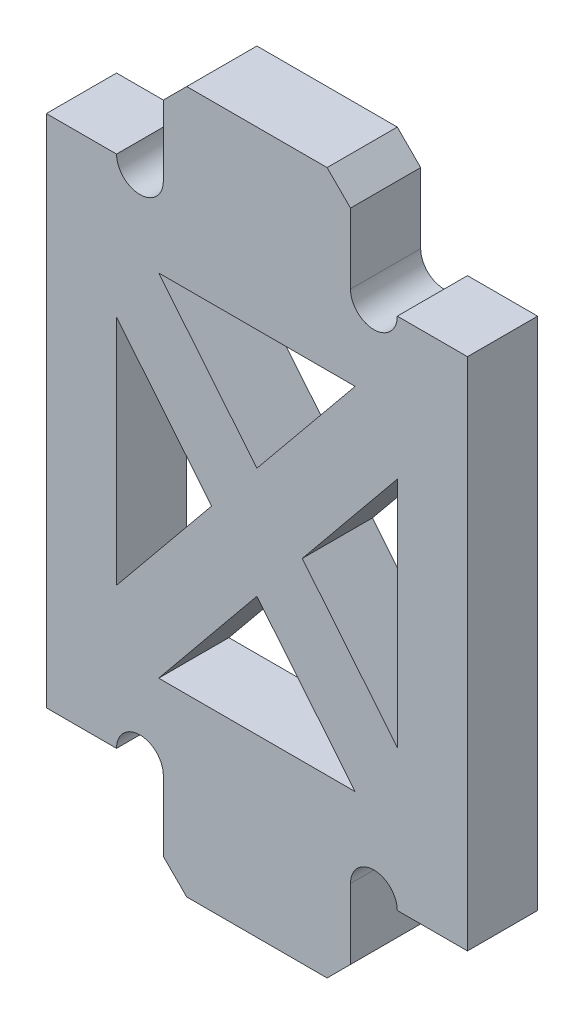
ISO-10303-21;
HEADER;
FILE_DESCRIPTION(('STEP AP214'),'2;1');
FILE_NAME('part.step','',(''),(''),'','','');
FILE_SCHEMA(('AUTOMOTIVE_DESIGN { 1 0 10303 214 1 1 1 1 }'));
ENDSEC;
DATA;
#1=APPLICATION_CONTEXT('core data for automotive mechanical design processes');
#2=APPLICATION_PROTOCOL_DEFINITION('international standard','automotive_design',2000,#1);
#3=PRODUCT_CONTEXT('',#1,'mechanical');
#4=PRODUCT('Part','Part','',(#3));
#5=PRODUCT_RELATED_PRODUCT_CATEGORY('part','',(#4));
#6=PRODUCT_DEFINITION_FORMATION('','',#4);
#7=PRODUCT_DEFINITION_CONTEXT('part definition',#1,'design');
#8=PRODUCT_DEFINITION('design','',#6,#7);
#9=PRODUCT_DEFINITION_SHAPE('','',#8);
#10=(LENGTH_UNIT() NAMED_UNIT(*) SI_UNIT(.MILLI.,.METRE.));
#11=(NAMED_UNIT(*) PLANE_ANGLE_UNIT() SI_UNIT($,.RADIAN.));
#12=(NAMED_UNIT(*) SI_UNIT($,.STERADIAN.) SOLID_ANGLE_UNIT());
#13=UNCERTAINTY_MEASURE_WITH_UNIT(LENGTH_MEASURE(1.E-05),#10,'distance_accuracy_value','');
#14=(GEOMETRIC_REPRESENTATION_CONTEXT(3) GLOBAL_UNCERTAINTY_ASSIGNED_CONTEXT((#13)) GLOBAL_UNIT_ASSIGNED_CONTEXT((#10,
#11,#12)) REPRESENTATION_CONTEXT('',''));
#15=CARTESIAN_POINT('',(0.,0.,0.));
#16=DIRECTION('',(0.,0.,1.));
#17=DIRECTION('',(1.,0.,0.));
#18=AXIS2_PLACEMENT_3D('',#15,#16,#17);
#19=CARTESIAN_POINT('',(0.,-11.,1.5));
#20=DIRECTION('',(0.,1.,0.));
#21=DIRECTION('',(0.,0.,1.));
#22=AXIS2_PLACEMENT_3D('',#19,#20,#21);
#23=PLANE('',#22);
#24=DIRECTION('',(1.,0.,0.));
#25=VECTOR('',#24,1.);
#26=CARTESIAN_POINT('',(0.,-11.,-1.5));
#27=LINE('',#26,#25);
#28=CARTESIAN_POINT('',(-9.,-11.,-1.5));
#29=VERTEX_POINT('',#28);
#30=CARTESIAN_POINT('',(-6.,-11.,-1.5));
#31=VERTEX_POINT('',#30);
#32=EDGE_CURVE('E373',#29,#31,#27,.T.);
#33=ORIENTED_EDGE('',*,*,#32,.T.);
#34=DIRECTION('',(0.,0.,-1.));
#35=VECTOR('',#34,1.);
#36=CARTESIAN_POINT('',(-6.,-11.,1.5));
#37=LINE('',#36,#35);
#38=CARTESIAN_POINT('',(-6.,-11.,1.5));
#39=VERTEX_POINT('',#38);
#40=EDGE_CURVE('E437',#39,#31,#37,.T.);
#41=ORIENTED_EDGE('',*,*,#40,.F.);
#42=DIRECTION('',(1.,0.,0.));
#43=VECTOR('',#42,1.);
#44=CARTESIAN_POINT('',(0.,-11.,1.5));
#45=LINE('',#44,#43);
#46=CARTESIAN_POINT('',(-9.,-11.,1.5));
#47=VERTEX_POINT('',#46);
#48=EDGE_CURVE('E301',#47,#39,#45,.T.);
#49=ORIENTED_EDGE('',*,*,#48,.F.);
#50=DIRECTION('',(0.,0.,-1.));
#51=VECTOR('',#50,1.);
#52=CARTESIAN_POINT('',(-9.,-11.,1.5));
#53=LINE('',#52,#51);
#54=EDGE_CURVE('E411',#47,#29,#53,.T.);
#55=ORIENTED_EDGE('',*,*,#54,.T.);
#56=EDGE_LOOP('',(#33,#41,#49,#55));
#57=FACE_BOUND('',#56,.T.);
#58=ADVANCED_FACE('F37',(#57),#23,.F.);
#59=CARTESIAN_POINT('',(-5.,-11.,1.5));
#60=DIRECTION('',(0.,0.,-1.));
#61=DIRECTION('',(-1.,0.,0.));
#62=AXIS2_PLACEMENT_3D('',#59,#60,#61);
#63=CYLINDRICAL_SURFACE('',#62,1.);
#64=CARTESIAN_POINT('',(-5.,-11.,-1.5));
#65=DIRECTION('',(0.,0.,1.));
#66=DIRECTION('',(1.,0.,0.));
#67=AXIS2_PLACEMENT_3D('',#64,#65,#66);
#68=CIRCLE('',#67,1.);
#69=CARTESIAN_POINT('',(-4.,-11.,-1.5));
#70=VERTEX_POINT('',#69);
#71=EDGE_CURVE('E376',#31,#70,#68,.F.);
#72=ORIENTED_EDGE('',*,*,#71,.T.);
#73=DIRECTION('',(0.,0.,-1.));
#74=VECTOR('',#73,1.);
#75=CARTESIAN_POINT('',(-4.,-11.,1.5));
#76=LINE('',#75,#74);
#77=CARTESIAN_POINT('',(-4.,-11.,1.5));
#78=VERTEX_POINT('',#77);
#79=EDGE_CURVE('E434',#78,#70,#76,.T.);
#80=ORIENTED_EDGE('',*,*,#79,.F.);
#81=CARTESIAN_POINT('',(-5.,-11.,1.5));
#82=DIRECTION('',(0.,0.,1.));
#83=DIRECTION('',(1.,0.,0.));
#84=AXIS2_PLACEMENT_3D('',#81,#82,#83);
#85=CIRCLE('',#84,1.);
#86=EDGE_CURVE('E304',#39,#78,#85,.F.);
#87=ORIENTED_EDGE('',*,*,#86,.F.);
#88=ORIENTED_EDGE('',*,*,#40,.T.);
#89=EDGE_LOOP('',(#72,#80,#87,#88));
#90=FACE_BOUND('',#89,.T.);
#91=ADVANCED_FACE('F529',(#90),#63,.F.);
#92=CARTESIAN_POINT('',(-4.,0.,1.5));
#93=DIRECTION('',(1.,0.,0.));
#94=DIRECTION('',(0.,0.,-1.));
#95=AXIS2_PLACEMENT_3D('',#92,#93,#94);
#96=PLANE('',#95);
#97=DIRECTION('',(0.,-1.,0.));
#98=VECTOR('',#97,1.);
#99=CARTESIAN_POINT('',(-4.,0.,-1.5));
#100=LINE('',#99,#98);
#101=CARTESIAN_POINT('',(-4.,-14.,-1.5));
#102=VERTEX_POINT('',#101);
#103=EDGE_CURVE('E379',#70,#102,#100,.T.);
#104=ORIENTED_EDGE('',*,*,#103,.T.);
#105=DIRECTION('',(0.,0.,1.));
#106=VECTOR('',#105,1.);
#107=CARTESIAN_POINT('',(-4.,-14.,1.5));
#108=LINE('',#107,#106);
#109=CARTESIAN_POINT('',(-4.,-14.,1.5));
#110=VERTEX_POINT('',#109);
#111=EDGE_CURVE('E481',#102,#110,#108,.T.);
#112=ORIENTED_EDGE('',*,*,#111,.T.);
#113=DIRECTION('',(0.,-1.,0.));
#114=VECTOR('',#113,1.);
#115=CARTESIAN_POINT('',(-4.,0.,1.5));
#116=LINE('',#115,#114);
#117=EDGE_CURVE('E307',#78,#110,#116,.T.);
#118=ORIENTED_EDGE('',*,*,#117,.F.);
#119=ORIENTED_EDGE('',*,*,#79,.T.);
#120=EDGE_LOOP('',(#104,#112,#118,#119));
#121=FACE_BOUND('',#120,.T.);
#122=ADVANCED_FACE('F585',(#121),#96,.F.);
#123=CARTESIAN_POINT('',(0.,-15.,1.5));
#124=DIRECTION('',(0.,1.,0.));
#125=DIRECTION('',(0.,0.,1.));
#126=AXIS2_PLACEMENT_3D('',#123,#124,#125);
#127=PLANE('',#126);
#128=DIRECTION('',(1.,0.,0.));
#129=VECTOR('',#128,1.);
#130=CARTESIAN_POINT('',(0.,-15.,-1.5));
#131=LINE('',#130,#129);
#132=CARTESIAN_POINT('',(-3.,-15.,-1.5));
#133=VERTEX_POINT('',#132);
#134=CARTESIAN_POINT('',(3.,-15.,-1.5));
#135=VERTEX_POINT('',#134);
#136=EDGE_CURVE('E382',#133,#135,#131,.T.);
#137=ORIENTED_EDGE('',*,*,#136,.T.);
#138=DIRECTION('',(0.,0.,1.));
#139=VECTOR('',#138,1.);
#140=CARTESIAN_POINT('',(3.,-15.,1.5));
#141=LINE('',#140,#139);
#142=CARTESIAN_POINT('',(3.,-15.,1.5));
#143=VERTEX_POINT('',#142);
#144=EDGE_CURVE('E473',#135,#143,#141,.T.);
#145=ORIENTED_EDGE('',*,*,#144,.T.);
#146=DIRECTION('',(1.,0.,0.));
#147=VECTOR('',#146,1.);
#148=CARTESIAN_POINT('',(0.,-15.,1.5));
#149=LINE('',#148,#147);
#150=CARTESIAN_POINT('',(-3.,-15.,1.5));
#151=VERTEX_POINT('',#150);
#152=EDGE_CURVE('E310',#151,#143,#149,.T.);
#153=ORIENTED_EDGE('',*,*,#152,.F.);
#154=DIRECTION('',(0.,0.,-1.));
#155=VECTOR('',#154,1.);
#156=CARTESIAN_POINT('',(-3.,-15.,1.5));
#157=LINE('',#156,#155);
#158=EDGE_CURVE('E470',#151,#133,#157,.T.);
#159=ORIENTED_EDGE('',*,*,#158,.T.);
#160=EDGE_LOOP('',(#137,#145,#153,#159));
#161=FACE_BOUND('',#160,.T.);
#162=ADVANCED_FACE('F541',(#161),#127,.F.);
#163=CARTESIAN_POINT('',(4.,0.,1.5));
#164=DIRECTION('',(1.,0.,0.));
#165=DIRECTION('',(0.,0.,-1.));
#166=AXIS2_PLACEMENT_3D('',#163,#164,#165);
#167=PLANE('',#166);
#168=DIRECTION('',(0.,-1.,0.));
#169=VECTOR('',#168,1.);
#170=CARTESIAN_POINT('',(4.,0.,1.5));
#171=LINE('',#170,#169);
#172=CARTESIAN_POINT('',(4.,-11.,1.5));
#173=VERTEX_POINT('',#172);
#174=CARTESIAN_POINT('',(4.,-14.,1.5));
#175=VERTEX_POINT('',#174);
#176=EDGE_CURVE('E313',#173,#175,#171,.T.);
#177=ORIENTED_EDGE('',*,*,#176,.T.);
#178=DIRECTION('',(0.,0.,-1.));
#179=VECTOR('',#178,1.);
#180=CARTESIAN_POINT('',(4.,-14.,-1.5));
#181=LINE('',#180,#179);
#182=CARTESIAN_POINT('',(4.,-14.,-1.5));
#183=VERTEX_POINT('',#182);
#184=EDGE_CURVE('E440',#175,#183,#181,.T.);
#185=ORIENTED_EDGE('',*,*,#184,.T.);
#186=DIRECTION('',(0.,-1.,0.));
#187=VECTOR('',#186,1.);
#188=CARTESIAN_POINT('',(4.,0.,-1.5));
#189=LINE('',#188,#187);
#190=CARTESIAN_POINT('',(4.,-11.,-1.5));
#191=VERTEX_POINT('',#190);
#192=EDGE_CURVE('E385',#191,#183,#189,.T.);
#193=ORIENTED_EDGE('',*,*,#192,.F.);
#194=DIRECTION('',(0.,0.,-1.));
#195=VECTOR('',#194,1.);
#196=CARTESIAN_POINT('',(4.,-11.,1.5));
#197=LINE('',#196,#195);
#198=EDGE_CURVE('E432',#173,#191,#197,.T.);
#199=ORIENTED_EDGE('',*,*,#198,.F.);
#200=EDGE_LOOP('',(#177,#185,#193,#199));
#201=FACE_BOUND('',#200,.T.);
#202=ADVANCED_FACE('F550',(#201),#167,.T.);
#203=CARTESIAN_POINT('',(5.,-11.,1.5));
#204=DIRECTION('',(0.,0.,-1.));
#205=DIRECTION('',(-1.,0.,0.));
#206=AXIS2_PLACEMENT_3D('',#203,#204,#205);
#207=CYLINDRICAL_SURFACE('',#206,1.);
#208=CARTESIAN_POINT('',(5.,-11.,-1.5));
#209=DIRECTION('',(0.,0.,1.));
#210=DIRECTION('',(1.,0.,0.));
#211=AXIS2_PLACEMENT_3D('',#208,#209,#210);
#212=CIRCLE('',#211,1.);
#213=CARTESIAN_POINT('',(6.,-11.,-1.5));
#214=VERTEX_POINT('',#213);
#215=EDGE_CURVE('E388',#214,#191,#212,.T.);
#216=ORIENTED_EDGE('',*,*,#215,.F.);
#217=DIRECTION('',(0.,0.,-1.));
#218=VECTOR('',#217,1.);
#219=CARTESIAN_POINT('',(6.,-11.,1.5));
#220=LINE('',#219,#218);
#221=CARTESIAN_POINT('',(6.,-11.,1.5));
#222=VERTEX_POINT('',#221);
#223=EDGE_CURVE('E430',#222,#214,#220,.T.);
#224=ORIENTED_EDGE('',*,*,#223,.F.);
#225=CARTESIAN_POINT('',(5.,-11.,1.5));
#226=DIRECTION('',(0.,0.,1.));
#227=DIRECTION('',(1.,0.,0.));
#228=AXIS2_PLACEMENT_3D('',#225,#226,#227);
#229=CIRCLE('',#228,1.);
#230=EDGE_CURVE('E316',#222,#173,#229,.T.);
#231=ORIENTED_EDGE('',*,*,#230,.T.);
#232=ORIENTED_EDGE('',*,*,#198,.T.);
#233=EDGE_LOOP('',(#216,#224,#231,#232));
#234=FACE_BOUND('',#233,.T.);
#235=ADVANCED_FACE('F555',(#234),#207,.F.);
#236=CARTESIAN_POINT('',(9.,-11.,-1.5));
#237=VERTEX_POINT('',#236);
#238=EDGE_CURVE('E377',#214,#237,#27,.T.);
#239=ORIENTED_EDGE('',*,*,#238,.T.);
#240=DIRECTION('',(0.,0.,-1.));
#241=VECTOR('',#240,1.);
#242=CARTESIAN_POINT('',(9.,-11.,1.5));
#243=LINE('',#242,#241);
#244=CARTESIAN_POINT('',(9.,-11.,1.5));
#245=VERTEX_POINT('',#244);
#246=EDGE_CURVE('E428',#245,#237,#243,.T.);
#247=ORIENTED_EDGE('',*,*,#246,.F.);
#248=EDGE_CURVE('E305',#222,#245,#45,.T.);
#249=ORIENTED_EDGE('',*,*,#248,.F.);
#250=ORIENTED_EDGE('',*,*,#223,.T.);
#251=EDGE_LOOP('',(#239,#247,#249,#250));
#252=FACE_BOUND('',#251,.T.);
#253=ADVANCED_FACE('F561',(#252),#23,.F.);
#254=CARTESIAN_POINT('',(9.,0.,1.5));
#255=DIRECTION('',(1.,0.,0.));
#256=DIRECTION('',(0.,0.,-1.));
#257=AXIS2_PLACEMENT_3D('',#254,#255,#256);
#258=PLANE('',#257);
#259=DIRECTION('',(0.,-1.,0.));
#260=VECTOR('',#259,1.);
#261=CARTESIAN_POINT('',(9.,0.,-1.5));
#262=LINE('',#261,#260);
#263=CARTESIAN_POINT('',(9.,11.,-1.5));
#264=VERTEX_POINT('',#263);
#265=EDGE_CURVE('E391',#264,#237,#262,.T.);
#266=ORIENTED_EDGE('',*,*,#265,.F.);
#267=DIRECTION('',(0.,0.,-1.));
#268=VECTOR('',#267,1.);
#269=CARTESIAN_POINT('',(9.,11.,1.5));
#270=LINE('',#269,#268);
#271=CARTESIAN_POINT('',(9.,11.,1.5));
#272=VERTEX_POINT('',#271);
#273=EDGE_CURVE('E426',#272,#264,#270,.T.);
#274=ORIENTED_EDGE('',*,*,#273,.F.);
#275=DIRECTION('',(0.,-1.,0.));
#276=VECTOR('',#275,1.);
#277=CARTESIAN_POINT('',(9.,0.,1.5));
#278=LINE('',#277,#276);
#279=EDGE_CURVE('E319',#272,#245,#278,.T.);
#280=ORIENTED_EDGE('',*,*,#279,.T.);
#281=ORIENTED_EDGE('',*,*,#246,.T.);
#282=EDGE_LOOP('',(#266,#274,#280,#281));
#283=FACE_BOUND('',#282,.T.);
#284=ADVANCED_FACE('F571',(#283),#258,.T.);
#285=CARTESIAN_POINT('',(0.,11.,1.5));
#286=DIRECTION('',(0.,1.,0.));
#287=DIRECTION('',(0.,0.,1.));
#288=AXIS2_PLACEMENT_3D('',#285,#286,#287);
#289=PLANE('',#288);
#290=DIRECTION('',(1.,0.,0.));
#291=VECTOR('',#290,1.);
#292=CARTESIAN_POINT('',(0.,11.,-1.5));
#293=LINE('',#292,#291);
#294=CARTESIAN_POINT('',(6.,11.,-1.5));
#295=VERTEX_POINT('',#294);
#296=EDGE_CURVE('E394',#295,#264,#293,.T.);
#297=ORIENTED_EDGE('',*,*,#296,.F.);
#298=DIRECTION('',(0.,0.,-1.));
#299=VECTOR('',#298,1.);
#300=CARTESIAN_POINT('',(6.,11.,1.5));
#301=LINE('',#300,#299);
#302=CARTESIAN_POINT('',(6.,11.,1.5));
#303=VERTEX_POINT('',#302);
#304=EDGE_CURVE('E424',#303,#295,#301,.T.);
#305=ORIENTED_EDGE('',*,*,#304,.F.);
#306=DIRECTION('',(1.,0.,0.));
#307=VECTOR('',#306,1.);
#308=CARTESIAN_POINT('',(0.,11.,1.5));
#309=LINE('',#308,#307);
#310=EDGE_CURVE('E322',#303,#272,#309,.T.);
#311=ORIENTED_EDGE('',*,*,#310,.T.);
#312=ORIENTED_EDGE('',*,*,#273,.T.);
#313=EDGE_LOOP('',(#297,#305,#311,#312));
#314=FACE_BOUND('',#313,.T.);
#315=ADVANCED_FACE('F566',(#314),#289,.T.);
#316=CARTESIAN_POINT('',(5.,11.,1.5));
#317=DIRECTION('',(0.,0.,-1.));
#318=DIRECTION('',(-1.,0.,0.));
#319=AXIS2_PLACEMENT_3D('',#316,#317,#318);
#320=CYLINDRICAL_SURFACE('',#319,1.);
#321=CARTESIAN_POINT('',(5.,11.,-1.5));
#322=DIRECTION('',(0.,0.,1.));
#323=DIRECTION('',(1.,0.,0.));
#324=AXIS2_PLACEMENT_3D('',#321,#322,#323);
#325=CIRCLE('',#324,1.);
#326=CARTESIAN_POINT('',(4.,11.,-1.5));
#327=VERTEX_POINT('',#326);
#328=EDGE_CURVE('E397',#295,#327,#325,.F.);
#329=ORIENTED_EDGE('',*,*,#328,.T.);
#330=DIRECTION('',(0.,0.,-1.));
#331=VECTOR('',#330,1.);
#332=CARTESIAN_POINT('',(4.,11.,1.5));
#333=LINE('',#332,#331);
#334=CARTESIAN_POINT('',(4.,11.,1.5));
#335=VERTEX_POINT('',#334);
#336=EDGE_CURVE('E421',#335,#327,#333,.T.);
#337=ORIENTED_EDGE('',*,*,#336,.F.);
#338=CARTESIAN_POINT('',(5.,11.,1.5));
#339=DIRECTION('',(0.,0.,1.));
#340=DIRECTION('',(1.,0.,0.));
#341=AXIS2_PLACEMENT_3D('',#338,#339,#340);
#342=CIRCLE('',#341,1.);
#343=EDGE_CURVE('E325',#303,#335,#342,.F.);
#344=ORIENTED_EDGE('',*,*,#343,.F.);
#345=ORIENTED_EDGE('',*,*,#304,.T.);
#346=EDGE_LOOP('',(#329,#337,#344,#345));
#347=FACE_BOUND('',#346,.T.);
#348=ADVANCED_FACE('F570',(#347),#320,.F.);
#349=CARTESIAN_POINT('',(4.,0.,1.5));
#350=DIRECTION('',(-1.,0.,0.));
#351=DIRECTION('',(0.,0.,1.));
#352=AXIS2_PLACEMENT_3D('',#349,#350,#351);
#353=PLANE('',#352);
#354=DIRECTION('',(0.,1.,0.));
#355=VECTOR('',#354,1.);
#356=CARTESIAN_POINT('',(4.,0.,-1.5));
#357=LINE('',#356,#355);
#358=CARTESIAN_POINT('',(4.,14.,-1.5));
#359=VERTEX_POINT('',#358);
#360=EDGE_CURVE('E399',#327,#359,#357,.T.);
#361=ORIENTED_EDGE('',*,*,#360,.T.);
#362=DIRECTION('',(0.,0.,1.));
#363=VECTOR('',#362,1.);
#364=CARTESIAN_POINT('',(4.,14.,1.5));
#365=LINE('',#364,#363);
#366=CARTESIAN_POINT('',(4.,14.,1.5));
#367=VERTEX_POINT('',#366);
#368=EDGE_CURVE('E45',#359,#367,#365,.T.);
#369=ORIENTED_EDGE('',*,*,#368,.T.);
#370=DIRECTION('',(0.,1.,0.));
#371=VECTOR('',#370,1.);
#372=CARTESIAN_POINT('',(4.,0.,1.5));
#373=LINE('',#372,#371);
#374=EDGE_CURVE('E328',#335,#367,#373,.T.);
#375=ORIENTED_EDGE('',*,*,#374,.F.);
#376=ORIENTED_EDGE('',*,*,#336,.T.);
#377=EDGE_LOOP('',(#361,#369,#375,#376));
#378=FACE_BOUND('',#377,.T.);
#379=ADVANCED_FACE('F490',(#378),#353,.F.);
#380=CARTESIAN_POINT('',(0.,15.,1.5));
#381=DIRECTION('',(0.,1.,0.));
#382=DIRECTION('',(0.,0.,1.));
#383=AXIS2_PLACEMENT_3D('',#380,#381,#382);
#384=PLANE('',#383);
#385=DIRECTION('',(1.,0.,0.));
#386=VECTOR('',#385,1.);
#387=CARTESIAN_POINT('',(0.,15.,1.5));
#388=LINE('',#387,#386);
#389=CARTESIAN_POINT('',(-3.,15.,1.5));
#390=VERTEX_POINT('',#389);
#391=CARTESIAN_POINT('',(3.,15.,1.5));
#392=VERTEX_POINT('',#391);
#393=EDGE_CURVE('E330',#390,#392,#388,.T.);
#394=ORIENTED_EDGE('',*,*,#393,.T.);
#395=DIRECTION('',(0.,0.,-1.));
#396=VECTOR('',#395,1.);
#397=CARTESIAN_POINT('',(3.,15.,-1.5));
#398=LINE('',#397,#396);
#399=CARTESIAN_POINT('',(3.,15.,-1.5));
#400=VERTEX_POINT('',#399);
#401=EDGE_CURVE('E485',#392,#400,#398,.T.);
#402=ORIENTED_EDGE('',*,*,#401,.T.);
#403=DIRECTION('',(1.,0.,0.));
#404=VECTOR('',#403,1.);
#405=CARTESIAN_POINT('',(0.,15.,-1.5));
#406=LINE('',#405,#404);
#407=CARTESIAN_POINT('',(-3.,15.,-1.5));
#408=VERTEX_POINT('',#407);
#409=EDGE_CURVE('E402',#408,#400,#406,.T.);
#410=ORIENTED_EDGE('',*,*,#409,.F.);
#411=DIRECTION('',(0.,0.,1.));
#412=VECTOR('',#411,1.);
#413=CARTESIAN_POINT('',(-3.,15.,1.5));
#414=LINE('',#413,#412);
#415=EDGE_CURVE('E483',#408,#390,#414,.T.);
#416=ORIENTED_EDGE('',*,*,#415,.T.);
#417=EDGE_LOOP('',(#394,#402,#410,#416));
#418=FACE_BOUND('',#417,.T.);
#419=ADVANCED_FACE('F500',(#418),#384,.T.);
#420=CARTESIAN_POINT('',(-4.,0.,1.5));
#421=DIRECTION('',(-1.,0.,0.));
#422=DIRECTION('',(0.,0.,1.));
#423=AXIS2_PLACEMENT_3D('',#420,#421,#422);
#424=PLANE('',#423);
#425=DIRECTION('',(0.,1.,0.));
#426=VECTOR('',#425,1.);
#427=CARTESIAN_POINT('',(-4.,0.,1.5));
#428=LINE('',#427,#426);
#429=CARTESIAN_POINT('',(-4.,11.,1.5));
#430=VERTEX_POINT('',#429);
#431=CARTESIAN_POINT('',(-4.,14.,1.5));
#432=VERTEX_POINT('',#431);
#433=EDGE_CURVE('E332',#430,#432,#428,.T.);
#434=ORIENTED_EDGE('',*,*,#433,.T.);
#435=DIRECTION('',(0.,0.,-1.));
#436=VECTOR('',#435,1.);
#437=CARTESIAN_POINT('',(-4.,14.,1.5));
#438=LINE('',#437,#436);
#439=CARTESIAN_POINT('',(-4.,14.,-1.5));
#440=VERTEX_POINT('',#439);
#441=EDGE_CURVE('E11',#432,#440,#438,.T.);
#442=ORIENTED_EDGE('',*,*,#441,.T.);
#443=DIRECTION('',(0.,1.,0.));
#444=VECTOR('',#443,1.);
#445=CARTESIAN_POINT('',(-4.,0.,-1.5));
#446=LINE('',#445,#444);
#447=CARTESIAN_POINT('',(-4.,11.,-1.5));
#448=VERTEX_POINT('',#447);
#449=EDGE_CURVE('E405',#448,#440,#446,.T.);
#450=ORIENTED_EDGE('',*,*,#449,.F.);
#451=DIRECTION('',(0.,0.,-1.));
#452=VECTOR('',#451,1.);
#453=CARTESIAN_POINT('',(-4.,11.,1.5));
#454=LINE('',#453,#452);
#455=EDGE_CURVE('E419',#430,#448,#454,.T.);
#456=ORIENTED_EDGE('',*,*,#455,.F.);
#457=EDGE_LOOP('',(#434,#442,#450,#456));
#458=FACE_BOUND('',#457,.T.);
#459=ADVANCED_FACE('F508',(#458),#424,.T.);
#460=CARTESIAN_POINT('',(-5.,11.,1.5));
#461=DIRECTION('',(0.,0.,-1.));
#462=DIRECTION('',(-1.,0.,0.));
#463=AXIS2_PLACEMENT_3D('',#460,#461,#462);
#464=CYLINDRICAL_SURFACE('',#463,1.);
#465=CARTESIAN_POINT('',(-5.,11.,-1.5));
#466=DIRECTION('',(0.,0.,1.));
#467=DIRECTION('',(1.,0.,0.));
#468=AXIS2_PLACEMENT_3D('',#465,#466,#467);
#469=CIRCLE('',#468,1.);
#470=CARTESIAN_POINT('',(-6.,11.,-1.5));
#471=VERTEX_POINT('',#470);
#472=EDGE_CURVE('E408',#471,#448,#469,.T.);
#473=ORIENTED_EDGE('',*,*,#472,.F.);
#474=DIRECTION('',(0.,0.,-1.));
#475=VECTOR('',#474,1.);
#476=CARTESIAN_POINT('',(-6.,11.,1.5));
#477=LINE('',#476,#475);
#478=CARTESIAN_POINT('',(-6.,11.,1.5));
#479=VERTEX_POINT('',#478);
#480=EDGE_CURVE('E417',#479,#471,#477,.T.);
#481=ORIENTED_EDGE('',*,*,#480,.F.);
#482=CARTESIAN_POINT('',(-5.,11.,1.5));
#483=DIRECTION('',(0.,0.,1.));
#484=DIRECTION('',(1.,0.,0.));
#485=AXIS2_PLACEMENT_3D('',#482,#483,#484);
#486=CIRCLE('',#485,1.);
#487=EDGE_CURVE('E334',#479,#430,#486,.T.);
#488=ORIENTED_EDGE('',*,*,#487,.T.);
#489=ORIENTED_EDGE('',*,*,#455,.T.);
#490=EDGE_LOOP('',(#473,#481,#488,#489));
#491=FACE_BOUND('',#490,.T.);
#492=ADVANCED_FACE('F514',(#491),#464,.F.);
#493=CARTESIAN_POINT('',(-9.,11.,-1.5));
#494=VERTEX_POINT('',#493);
#495=EDGE_CURVE('E273',#494,#471,#293,.T.);
#496=ORIENTED_EDGE('',*,*,#495,.F.);
#497=DIRECTION('',(0.,0.,-1.));
#498=VECTOR('',#497,1.);
#499=CARTESIAN_POINT('',(-9.,11.,1.5));
#500=LINE('',#499,#498);
#501=CARTESIAN_POINT('',(-9.,11.,1.5));
#502=VERTEX_POINT('',#501);
#503=EDGE_CURVE('E414',#502,#494,#500,.T.);
#504=ORIENTED_EDGE('',*,*,#503,.F.);
#505=EDGE_CURVE('E326',#502,#479,#309,.T.);
#506=ORIENTED_EDGE('',*,*,#505,.T.);
#507=ORIENTED_EDGE('',*,*,#480,.T.);
#508=EDGE_LOOP('',(#496,#504,#506,#507));
#509=FACE_BOUND('',#508,.T.);
#510=ADVANCED_FACE('F518',(#509),#289,.T.);
#511=CARTESIAN_POINT('',(-1.16093594880498,-0.949856685385895,1.5));
#512=DIRECTION('',(-0.773957299203321,-0.633237790257263,0.));
#513=DIRECTION('',(0.633237790257263,-0.773957299203321,0.));
#514=AXIS2_PLACEMENT_3D('',#511,#512,#513);
#515=PLANE('',#514);
#516=DIRECTION('',(-0.633237790257263,0.773957299203321,0.));
#517=VECTOR('',#516,1.);
#518=CARTESIAN_POINT('',(-1.16093594880498,-0.949856685385895,-1.5));
#519=LINE('',#518,#517);
#520=CARTESIAN_POINT('',(-1.93809141866617,0.,-1.5));
#521=VERTEX_POINT('',#520);
#522=CARTESIAN_POINT('',(-6.,4.96455493274135,-1.5));
#523=VERTEX_POINT('',#522);
#524=EDGE_CURVE('E364',#521,#523,#519,.T.);
#525=ORIENTED_EDGE('',*,*,#524,.F.);
#526=DIRECTION('',(0.,0.,-1.));
#527=VECTOR('',#526,1.);
#528=CARTESIAN_POINT('',(-1.93809141866617,0.,1.5));
#529=LINE('',#528,#527);
#530=CARTESIAN_POINT('',(-1.93809141866617,0.,1.5));
#531=VERTEX_POINT('',#530);
#532=EDGE_CURVE('E415',#531,#521,#529,.T.);
#533=ORIENTED_EDGE('',*,*,#532,.F.);
#534=DIRECTION('',(-0.633237790257263,0.773957299203321,0.));
#535=VECTOR('',#534,1.);
#536=CARTESIAN_POINT('',(-1.16093594880498,-0.949856685385895,1.5));
#537=LINE('',#536,#535);
#538=CARTESIAN_POINT('',(-6.,4.96455493274135,1.5));
#539=VERTEX_POINT('',#538);
#540=EDGE_CURVE('E293',#531,#539,#537,.T.);
#541=ORIENTED_EDGE('',*,*,#540,.T.);
#542=DIRECTION('',(0.,0.,-1.));
#543=VECTOR('',#542,1.);
#544=CARTESIAN_POINT('',(-6.,4.96455493274135,1.5));
#545=LINE('',#544,#543);
#546=EDGE_CURVE('E441',#539,#523,#545,.T.);
#547=ORIENTED_EDGE('',*,*,#546,.T.);
#548=EDGE_LOOP('',(#525,#533,#541,#547));
#549=FACE_BOUND('',#548,.T.);
#550=ADVANCED_FACE('F605',(#549),#515,.T.);
#551=CARTESIAN_POINT('',(-1.16093594880498,0.949856685385895,1.5));
#552=DIRECTION('',(0.773957299203321,-0.633237790257263,0.));
#553=DIRECTION('',(0.633237790257263,0.773957299203321,0.));
#554=AXIS2_PLACEMENT_3D('',#551,#552,#553);
#555=PLANE('',#554);
#556=DIRECTION('',(-0.633237790257263,-0.773957299203321,0.));
#557=VECTOR('',#556,1.);
#558=CARTESIAN_POINT('',(-1.16093594880498,0.949856685385895,-1.5));
#559=LINE('',#558,#557);
#560=CARTESIAN_POINT('',(-6.,-4.96455493274135,-1.5));
#561=VERTEX_POINT('',#560);
#562=EDGE_CURVE('E367',#521,#561,#559,.T.);
#563=ORIENTED_EDGE('',*,*,#562,.T.);
#564=DIRECTION('',(0.,0.,-1.));
#565=VECTOR('',#564,1.);
#566=CARTESIAN_POINT('',(-6.,-4.96455493274135,1.5));
#567=LINE('',#566,#565);
#568=CARTESIAN_POINT('',(-6.,-4.96455493274135,1.5));
#569=VERTEX_POINT('',#568);
#570=EDGE_CURVE('E443',#569,#561,#567,.T.);
#571=ORIENTED_EDGE('',*,*,#570,.F.);
#572=DIRECTION('',(-0.633237790257263,-0.773957299203321,0.));
#573=VECTOR('',#572,1.);
#574=CARTESIAN_POINT('',(-1.16093594880498,0.949856685385895,1.5));
#575=LINE('',#574,#573);
#576=EDGE_CURVE('E296',#531,#569,#575,.T.);
#577=ORIENTED_EDGE('',*,*,#576,.F.);
#578=ORIENTED_EDGE('',*,*,#532,.T.);
#579=EDGE_LOOP('',(#563,#571,#577,#578));
#580=FACE_BOUND('',#579,.T.);
#581=ADVANCED_FACE('F601',(#580),#555,.F.);
#582=CARTESIAN_POINT('',(0.,7.5,1.5));
#583=DIRECTION('',(0.,-1.,0.));
#584=DIRECTION('',(0.,0.,-1.));
#585=AXIS2_PLACEMENT_3D('',#582,#583,#584);
#586=PLANE('',#585);
#587=DIRECTION('',(-1.,0.,0.));
#588=VECTOR('',#587,1.);
#589=CARTESIAN_POINT('',(0.,7.5,-1.5));
#590=LINE('',#589,#588);
#591=CARTESIAN_POINT('',(4.19827221769747,7.5,-1.5));
#592=VERTEX_POINT('',#591);
#593=CARTESIAN_POINT('',(-4.19827221769747,7.5,-1.5));
#594=VERTEX_POINT('',#593);
#595=EDGE_CURVE('E355',#592,#594,#590,.T.);
#596=ORIENTED_EDGE('',*,*,#595,.F.);
#597=DIRECTION('',(0.,0.,-1.));
#598=VECTOR('',#597,1.);
#599=CARTESIAN_POINT('',(4.19827221769747,7.5,1.5));
#600=LINE('',#599,#598);
#601=CARTESIAN_POINT('',(4.19827221769747,7.5,1.5));
#602=VERTEX_POINT('',#601);
#603=EDGE_CURVE('E444',#602,#592,#600,.T.);
#604=ORIENTED_EDGE('',*,*,#603,.F.);
#605=DIRECTION('',(-1.,0.,0.));
#606=VECTOR('',#605,1.);
#607=CARTESIAN_POINT('',(0.,7.5,1.5));
#608=LINE('',#607,#606);
#609=CARTESIAN_POINT('',(-4.19827221769747,7.5,1.5));
#610=VERTEX_POINT('',#609);
#611=EDGE_CURVE('E285',#602,#610,#608,.T.);
#612=ORIENTED_EDGE('',*,*,#611,.T.);
#613=DIRECTION('',(0.,0.,-1.));
#614=VECTOR('',#613,1.);
#615=CARTESIAN_POINT('',(-4.19827221769747,7.5,1.5));
#616=LINE('',#615,#614);
#617=EDGE_CURVE('E447',#610,#594,#616,.T.);
#618=ORIENTED_EDGE('',*,*,#617,.T.);
#619=EDGE_LOOP('',(#596,#604,#612,#618));
#620=FACE_BOUND('',#619,.T.);
#621=ADVANCED_FACE('F604',(#620),#586,.T.);
#622=CARTESIAN_POINT('',(-1.16093594880498,0.949856685385891,1.5));
#623=DIRECTION('',(0.773957299203321,-0.633237790257262,0.));
#624=DIRECTION('',(0.633237790257262,0.773957299203321,0.));
#625=AXIS2_PLACEMENT_3D('',#622,#623,#624);
#626=PLANE('',#625);
#627=DIRECTION('',(-0.633237790257262,-0.773957299203321,0.));
#628=VECTOR('',#627,1.);
#629=CARTESIAN_POINT('',(-1.16093594880498,0.949856685385891,-1.5));
#630=LINE('',#629,#628);
#631=CARTESIAN_POINT('',(0.,2.36877840059198,-1.5));
#632=VERTEX_POINT('',#631);
#633=EDGE_CURVE('E358',#592,#632,#630,.T.);
#634=ORIENTED_EDGE('',*,*,#633,.T.);
#635=DIRECTION('',(0.,0.,-1.));
#636=VECTOR('',#635,1.);
#637=CARTESIAN_POINT('',(0.,2.36877840059198,1.5));
#638=LINE('',#637,#636);
#639=CARTESIAN_POINT('',(0.,2.36877840059198,1.5));
#640=VERTEX_POINT('',#639);
#641=EDGE_CURVE('E449',#640,#632,#638,.T.);
#642=ORIENTED_EDGE('',*,*,#641,.F.);
#643=DIRECTION('',(-0.633237790257262,-0.773957299203321,0.));
#644=VECTOR('',#643,1.);
#645=CARTESIAN_POINT('',(-1.16093594880498,0.949856685385891,1.5));
#646=LINE('',#645,#644);
#647=EDGE_CURVE('E288',#602,#640,#646,.T.);
#648=ORIENTED_EDGE('',*,*,#647,.F.);
#649=ORIENTED_EDGE('',*,*,#603,.T.);
#650=EDGE_LOOP('',(#634,#642,#648,#649));
#651=FACE_BOUND('',#650,.T.);
#652=ADVANCED_FACE('F614',(#651),#626,.F.);
#653=CARTESIAN_POINT('',(1.16093594880498,0.949856685385895,1.5));
#654=DIRECTION('',(0.773957299203321,0.633237790257263,0.));
#655=DIRECTION('',(-0.633237790257263,0.773957299203321,0.));
#656=AXIS2_PLACEMENT_3D('',#653,#654,#655);
#657=PLANE('',#656);
#658=DIRECTION('',(0.633237790257263,-0.773957299203321,0.));
#659=VECTOR('',#658,1.);
#660=CARTESIAN_POINT('',(1.16093594880498,0.949856685385895,-1.5));
#661=LINE('',#660,#659);
#662=CARTESIAN_POINT('',(1.93809141866617,0.,-1.5));
#663=VERTEX_POINT('',#662);
#664=CARTESIAN_POINT('',(6.,-4.96455493274135,-1.5));
#665=VERTEX_POINT('',#664);
#666=EDGE_CURVE('E346',#663,#665,#661,.T.);
#667=ORIENTED_EDGE('',*,*,#666,.F.);
#668=DIRECTION('',(0.,0.,-1.));
#669=VECTOR('',#668,1.);
#670=CARTESIAN_POINT('',(1.93809141866617,0.,1.5));
#671=LINE('',#670,#669);
#672=CARTESIAN_POINT('',(1.93809141866617,0.,1.5));
#673=VERTEX_POINT('',#672);
#674=EDGE_CURVE('E450',#673,#663,#671,.T.);
#675=ORIENTED_EDGE('',*,*,#674,.F.);
#676=DIRECTION('',(0.633237790257263,-0.773957299203321,0.));
#677=VECTOR('',#676,1.);
#678=CARTESIAN_POINT('',(1.16093594880498,0.949856685385895,1.5));
#679=LINE('',#678,#677);
#680=CARTESIAN_POINT('',(6.,-4.96455493274135,1.5));
#681=VERTEX_POINT('',#680);
#682=EDGE_CURVE('E277',#673,#681,#679,.T.);
#683=ORIENTED_EDGE('',*,*,#682,.T.);
#684=DIRECTION('',(0.,0.,-1.));
#685=VECTOR('',#684,1.);
#686=CARTESIAN_POINT('',(6.,-4.96455493274135,1.5));
#687=LINE('',#686,#685);
#688=EDGE_CURVE('E257',#681,#665,#687,.T.);
#689=ORIENTED_EDGE('',*,*,#688,.T.);
#690=EDGE_LOOP('',(#667,#675,#683,#689));
#691=FACE_BOUND('',#690,.T.);
#692=ADVANCED_FACE('F617',(#691),#657,.T.);
#693=CARTESIAN_POINT('',(1.16093594880498,-0.949856685385895,1.5));
#694=DIRECTION('',(-0.773957299203321,0.633237790257263,0.));
#695=DIRECTION('',(-0.633237790257263,-0.773957299203321,0.));
#696=AXIS2_PLACEMENT_3D('',#693,#694,#695);
#697=PLANE('',#696);
#698=DIRECTION('',(0.633237790257263,0.773957299203321,0.));
#699=VECTOR('',#698,1.);
#700=CARTESIAN_POINT('',(1.16093594880498,-0.949856685385895,-1.5));
#701=LINE('',#700,#699);
#702=CARTESIAN_POINT('',(6.,4.96455493274135,-1.5));
#703=VERTEX_POINT('',#702);
#704=EDGE_CURVE('E349',#663,#703,#701,.T.);
#705=ORIENTED_EDGE('',*,*,#704,.T.);
#706=DIRECTION('',(0.,0.,-1.));
#707=VECTOR('',#706,1.);
#708=CARTESIAN_POINT('',(6.,4.96455493274135,1.5));
#709=LINE('',#708,#707);
#710=CARTESIAN_POINT('',(6.,4.96455493274135,1.5));
#711=VERTEX_POINT('',#710);
#712=EDGE_CURVE('E454',#711,#703,#709,.T.);
#713=ORIENTED_EDGE('',*,*,#712,.F.);
#714=DIRECTION('',(0.633237790257263,0.773957299203321,0.));
#715=VECTOR('',#714,1.);
#716=CARTESIAN_POINT('',(1.16093594880498,-0.949856685385895,1.5));
#717=LINE('',#716,#715);
#718=EDGE_CURVE('E280',#673,#711,#717,.T.);
#719=ORIENTED_EDGE('',*,*,#718,.F.);
#720=ORIENTED_EDGE('',*,*,#674,.T.);
#721=EDGE_LOOP('',(#705,#713,#719,#720));
#722=FACE_BOUND('',#721,.T.);
#723=ADVANCED_FACE('F626',(#722),#697,.F.);
#724=CARTESIAN_POINT('',(-1.16093594880498,-0.949856685385891,1.5));
#725=DIRECTION('',(-0.773957299203321,-0.633237790257262,0.));
#726=DIRECTION('',(0.633237790257262,-0.773957299203321,0.));
#727=AXIS2_PLACEMENT_3D('',#724,#725,#726);
#728=PLANE('',#727);
#729=DIRECTION('',(-0.633237790257262,0.773957299203321,0.));
#730=VECTOR('',#729,1.);
#731=CARTESIAN_POINT('',(-1.16093594880498,-0.949856685385891,-1.5));
#732=LINE('',#731,#730);
#733=CARTESIAN_POINT('',(4.19827221769747,-7.5,-1.5));
#734=VERTEX_POINT('',#733);
#735=CARTESIAN_POINT('',(0.,-2.36877840059198,-1.5));
#736=VERTEX_POINT('',#735);
#737=EDGE_CURVE('E254',#734,#736,#732,.T.);
#738=ORIENTED_EDGE('',*,*,#737,.F.);
#739=DIRECTION('',(0.,0.,-1.));
#740=VECTOR('',#739,1.);
#741=CARTESIAN_POINT('',(4.19827221769747,-7.5,1.5));
#742=LINE('',#741,#740);
#743=CARTESIAN_POINT('',(4.19827221769747,-7.5,1.5));
#744=VERTEX_POINT('',#743);
#745=EDGE_CURVE('E248',#744,#734,#742,.T.);
#746=ORIENTED_EDGE('',*,*,#745,.F.);
#747=DIRECTION('',(-0.633237790257262,0.773957299203321,0.));
#748=VECTOR('',#747,1.);
#749=CARTESIAN_POINT('',(-1.16093594880498,-0.949856685385891,1.5));
#750=LINE('',#749,#748);
#751=CARTESIAN_POINT('',(0.,-2.36877840059198,1.5));
#752=VERTEX_POINT('',#751);
#753=EDGE_CURVE('E252',#744,#752,#750,.T.);
#754=ORIENTED_EDGE('',*,*,#753,.T.);
#755=DIRECTION('',(0.,0.,-1.));
#756=VECTOR('',#755,1.);
#757=CARTESIAN_POINT('',(0.,-2.36877840059198,1.5));
#758=LINE('',#757,#756);
#759=EDGE_CURVE('E339',#752,#736,#758,.T.);
#760=ORIENTED_EDGE('',*,*,#759,.T.);
#761=EDGE_LOOP('',(#738,#746,#754,#760));
#762=FACE_BOUND('',#761,.T.);
#763=ADVANCED_FACE('F250',(#762),#728,.T.);
#764=CARTESIAN_POINT('',(0.,-7.5,1.5));
#765=DIRECTION('',(0.,-1.,0.));
#766=DIRECTION('',(0.,0.,-1.));
#767=AXIS2_PLACEMENT_3D('',#764,#765,#766);
#768=PLANE('',#767);
#769=DIRECTION('',(-1.,0.,0.));
#770=VECTOR('',#769,1.);
#771=CARTESIAN_POINT('',(0.,-7.5,-1.5));
#772=LINE('',#771,#770);
#773=CARTESIAN_POINT('',(-4.19827221769747,-7.5,-1.5));
#774=VERTEX_POINT('',#773);
#775=EDGE_CURVE('E341',#734,#774,#772,.T.);
#776=ORIENTED_EDGE('',*,*,#775,.T.);
#777=DIRECTION('',(0.,0.,-1.));
#778=VECTOR('',#777,1.);
#779=CARTESIAN_POINT('',(-4.19827221769747,-7.5,1.5));
#780=LINE('',#779,#778);
#781=CARTESIAN_POINT('',(-4.19827221769747,-7.5,1.5));
#782=VERTEX_POINT('',#781);
#783=EDGE_CURVE('E258',#782,#774,#780,.T.);
#784=ORIENTED_EDGE('',*,*,#783,.F.);
#785=DIRECTION('',(-1.,0.,0.));
#786=VECTOR('',#785,1.);
#787=CARTESIAN_POINT('',(0.,-7.5,1.5));
#788=LINE('',#787,#786);
#789=EDGE_CURVE('E261',#744,#782,#788,.T.);
#790=ORIENTED_EDGE('',*,*,#789,.F.);
#791=ORIENTED_EDGE('',*,*,#745,.T.);
#792=EDGE_LOOP('',(#776,#784,#790,#791));
#793=FACE_BOUND('',#792,.T.);
#794=ADVANCED_FACE('F262',(#793),#768,.F.);
#795=CARTESIAN_POINT('',(-6.,0.,1.5));
#796=DIRECTION('',(1.,0.,0.));
#797=DIRECTION('',(0.,0.,-1.));
#798=AXIS2_PLACEMENT_3D('',#795,#796,#797);
#799=PLANE('',#798);
#800=DIRECTION('',(0.,-1.,0.));
#801=VECTOR('',#800,1.);
#802=CARTESIAN_POINT('',(-6.,0.,-1.5));
#803=LINE('',#802,#801);
#804=EDGE_CURVE('E370',#523,#561,#803,.T.);
#805=ORIENTED_EDGE('',*,*,#804,.F.);
#806=ORIENTED_EDGE('',*,*,#546,.F.);
#807=DIRECTION('',(0.,-1.,0.));
#808=VECTOR('',#807,1.);
#809=CARTESIAN_POINT('',(-6.,0.,1.5));
#810=LINE('',#809,#808);
#811=EDGE_CURVE('E298',#539,#569,#810,.T.);
#812=ORIENTED_EDGE('',*,*,#811,.T.);
#813=ORIENTED_EDGE('',*,*,#570,.T.);
#814=EDGE_LOOP('',(#805,#806,#812,#813));
#815=FACE_BOUND('',#814,.T.);
#816=ADVANCED_FACE('F596',(#815),#799,.T.);
#817=CARTESIAN_POINT('',(1.16093594880498,0.949856685385891,1.5));
#818=DIRECTION('',(0.773957299203321,0.633237790257262,0.));
#819=DIRECTION('',(-0.633237790257262,0.773957299203321,0.));
#820=AXIS2_PLACEMENT_3D('',#817,#818,#819);
#821=PLANE('',#820);
#822=DIRECTION('',(0.633237790257262,-0.773957299203321,0.));
#823=VECTOR('',#822,1.);
#824=CARTESIAN_POINT('',(1.16093594880498,0.949856685385891,-1.5));
#825=LINE('',#824,#823);
#826=EDGE_CURVE('E361',#594,#632,#825,.T.);
#827=ORIENTED_EDGE('',*,*,#826,.F.);
#828=ORIENTED_EDGE('',*,*,#617,.F.);
#829=DIRECTION('',(0.633237790257262,-0.773957299203321,0.));
#830=VECTOR('',#829,1.);
#831=CARTESIAN_POINT('',(1.16093594880498,0.949856685385891,1.5));
#832=LINE('',#831,#830);
#833=EDGE_CURVE('E290',#610,#640,#832,.T.);
#834=ORIENTED_EDGE('',*,*,#833,.T.);
#835=ORIENTED_EDGE('',*,*,#641,.T.);
#836=EDGE_LOOP('',(#827,#828,#834,#835));
#837=FACE_BOUND('',#836,.T.);
#838=ADVANCED_FACE('F599',(#837),#821,.T.);
#839=CARTESIAN_POINT('',(6.,0.,1.5));
#840=DIRECTION('',(1.,0.,0.));
#841=DIRECTION('',(0.,0.,-1.));
#842=AXIS2_PLACEMENT_3D('',#839,#840,#841);
#843=PLANE('',#842);
#844=DIRECTION('',(0.,-1.,0.));
#845=VECTOR('',#844,1.);
#846=CARTESIAN_POINT('',(6.,0.,-1.5));
#847=LINE('',#846,#845);
#848=EDGE_CURVE('E352',#703,#665,#847,.T.);
#849=ORIENTED_EDGE('',*,*,#848,.T.);
#850=ORIENTED_EDGE('',*,*,#688,.F.);
#851=DIRECTION('',(0.,-1.,0.));
#852=VECTOR('',#851,1.);
#853=CARTESIAN_POINT('',(6.,0.,1.5));
#854=LINE('',#853,#852);
#855=EDGE_CURVE('E283',#711,#681,#854,.T.);
#856=ORIENTED_EDGE('',*,*,#855,.F.);
#857=ORIENTED_EDGE('',*,*,#712,.T.);
#858=EDGE_LOOP('',(#849,#850,#856,#857));
#859=FACE_BOUND('',#858,.T.);
#860=ADVANCED_FACE('F612',(#859),#843,.F.);
#861=CARTESIAN_POINT('',(1.16093594880498,-0.949856685385891,1.5));
#862=DIRECTION('',(-0.773957299203321,0.633237790257262,0.));
#863=DIRECTION('',(-0.633237790257262,-0.773957299203321,0.));
#864=AXIS2_PLACEMENT_3D('',#861,#862,#863);
#865=PLANE('',#864);
#866=DIRECTION('',(0.633237790257262,0.773957299203321,0.));
#867=VECTOR('',#866,1.);
#868=CARTESIAN_POINT('',(1.16093594880498,-0.949856685385891,-1.5));
#869=LINE('',#868,#867);
#870=EDGE_CURVE('E343',#774,#736,#869,.T.);
#871=ORIENTED_EDGE('',*,*,#870,.T.);
#872=ORIENTED_EDGE('',*,*,#759,.F.);
#873=DIRECTION('',(0.633237790257262,0.773957299203321,0.));
#874=VECTOR('',#873,1.);
#875=CARTESIAN_POINT('',(1.16093594880498,-0.949856685385891,1.5));
#876=LINE('',#875,#874);
#877=EDGE_CURVE('E266',#782,#752,#876,.T.);
#878=ORIENTED_EDGE('',*,*,#877,.F.);
#879=ORIENTED_EDGE('',*,*,#783,.T.);
#880=EDGE_LOOP('',(#871,#872,#878,#879));
#881=FACE_BOUND('',#880,.T.);
#882=ADVANCED_FACE('F624',(#881),#865,.F.);
#883=CARTESIAN_POINT('',(-9.,0.,1.5));
#884=DIRECTION('',(1.,0.,0.));
#885=DIRECTION('',(0.,0.,-1.));
#886=AXIS2_PLACEMENT_3D('',#883,#884,#885);
#887=PLANE('',#886);
#888=DIRECTION('',(0.,-1.,0.));
#889=VECTOR('',#888,1.);
#890=CARTESIAN_POINT('',(-9.,0.,-1.5));
#891=LINE('',#890,#889);
#892=EDGE_CURVE('E271',#494,#29,#891,.T.);
#893=ORIENTED_EDGE('',*,*,#892,.T.);
#894=ORIENTED_EDGE('',*,*,#54,.F.);
#895=DIRECTION('',(0.,-1.,0.));
#896=VECTOR('',#895,1.);
#897=CARTESIAN_POINT('',(-9.,0.,1.5));
#898=LINE('',#897,#896);
#899=EDGE_CURVE('E337',#502,#47,#898,.T.);
#900=ORIENTED_EDGE('',*,*,#899,.F.);
#901=ORIENTED_EDGE('',*,*,#503,.T.);
#902=EDGE_LOOP('',(#893,#894,#900,#901));
#903=FACE_BOUND('',#902,.T.);
#904=ADVANCED_FACE('F524',(#903),#887,.F.);
#905=CARTESIAN_POINT('',(0.,0.,1.5));
#906=DIRECTION('',(0.,0.,1.));
#907=DIRECTION('',(1.,0.,0.));
#908=AXIS2_PLACEMENT_3D('',#905,#906,#907);
#909=PLANE('',#908);
#910=ORIENTED_EDGE('',*,*,#753,.F.);
#911=ORIENTED_EDGE('',*,*,#789,.T.);
#912=ORIENTED_EDGE('',*,*,#877,.T.);
#913=EDGE_LOOP('',(#910,#911,#912));
#914=FACE_BOUND('',#913,.T.);
#915=ORIENTED_EDGE('',*,*,#682,.F.);
#916=ORIENTED_EDGE('',*,*,#718,.T.);
#917=ORIENTED_EDGE('',*,*,#855,.T.);
#918=EDGE_LOOP('',(#915,#916,#917));
#919=FACE_BOUND('',#918,.T.);
#920=ORIENTED_EDGE('',*,*,#611,.F.);
#921=ORIENTED_EDGE('',*,*,#647,.T.);
#922=ORIENTED_EDGE('',*,*,#833,.F.);
#923=EDGE_LOOP('',(#920,#921,#922));
#924=FACE_BOUND('',#923,.T.);
#925=ORIENTED_EDGE('',*,*,#540,.F.);
#926=ORIENTED_EDGE('',*,*,#576,.T.);
#927=ORIENTED_EDGE('',*,*,#811,.F.);
#928=EDGE_LOOP('',(#925,#926,#927));
#929=FACE_BOUND('',#928,.T.);
#930=ORIENTED_EDGE('',*,*,#152,.T.);
#931=DIRECTION('',(0.707106781186549,0.707106781186546,0.));
#932=VECTOR('',#931,1.);
#933=CARTESIAN_POINT('',(8.99999999999999,-9.00000000000002,1.5));
#934=LINE('',#933,#932);
#935=EDGE_CURVE('E479',#143,#175,#934,.T.);
#936=ORIENTED_EDGE('',*,*,#935,.T.);
#937=ORIENTED_EDGE('',*,*,#176,.F.);
#938=ORIENTED_EDGE('',*,*,#230,.F.);
#939=ORIENTED_EDGE('',*,*,#248,.T.);
#940=ORIENTED_EDGE('',*,*,#279,.F.);
#941=ORIENTED_EDGE('',*,*,#310,.F.);
#942=ORIENTED_EDGE('',*,*,#343,.T.);
#943=ORIENTED_EDGE('',*,*,#374,.T.);
#944=DIRECTION('',(-0.707106781186546,0.707106781186549,0.));
#945=VECTOR('',#944,1.);
#946=CARTESIAN_POINT('',(9.,8.99999999999997,1.5));
#947=LINE('',#946,#945);
#948=EDGE_CURVE('E58',#367,#392,#947,.T.);
#949=ORIENTED_EDGE('',*,*,#948,.T.);
#950=ORIENTED_EDGE('',*,*,#393,.F.);
#951=DIRECTION('',(0.707106781186549,0.707106781186546,0.));
#952=VECTOR('',#951,1.);
#953=CARTESIAN_POINT('',(-8.99999999999999,9.00000000000002,1.5));
#954=LINE('',#953,#952);
#955=EDGE_CURVE('E52',#390,#432,#954,.F.);
#956=ORIENTED_EDGE('',*,*,#955,.T.);
#957=ORIENTED_EDGE('',*,*,#433,.F.);
#958=ORIENTED_EDGE('',*,*,#487,.F.);
#959=ORIENTED_EDGE('',*,*,#505,.F.);
#960=ORIENTED_EDGE('',*,*,#899,.T.);
#961=ORIENTED_EDGE('',*,*,#48,.T.);
#962=ORIENTED_EDGE('',*,*,#86,.T.);
#963=ORIENTED_EDGE('',*,*,#117,.T.);
#964=DIRECTION('',(-0.707106781186546,0.707106781186549,0.));
#965=VECTOR('',#964,1.);
#966=CARTESIAN_POINT('',(-9.,-8.99999999999997,1.5));
#967=LINE('',#966,#965);
#968=EDGE_CURVE('E477',#110,#151,#967,.F.);
#969=ORIENTED_EDGE('',*,*,#968,.T.);
#970=EDGE_LOOP('',(#930,#936,#937,#938,#939,#940,#941,#942,#943,#949,#950,#956,#957,#958,#959,
#960,#961,#962,#963,#969));
#971=FACE_BOUND('',#970,.T.);
#972=ADVANCED_FACE('F268',(#914,#919,#924,#929,#971),#909,.T.);
#973=CARTESIAN_POINT('',(0.,0.,-1.5));
#974=DIRECTION('',(0.,0.,1.));
#975=DIRECTION('',(1.,0.,0.));
#976=AXIS2_PLACEMENT_3D('',#973,#974,#975);
#977=PLANE('',#976);
#978=ORIENTED_EDGE('',*,*,#737,.T.);
#979=ORIENTED_EDGE('',*,*,#870,.F.);
#980=ORIENTED_EDGE('',*,*,#775,.F.);
#981=EDGE_LOOP('',(#978,#979,#980));
#982=FACE_BOUND('',#981,.T.);
#983=ORIENTED_EDGE('',*,*,#666,.T.);
#984=ORIENTED_EDGE('',*,*,#848,.F.);
#985=ORIENTED_EDGE('',*,*,#704,.F.);
#986=EDGE_LOOP('',(#983,#984,#985));
#987=FACE_BOUND('',#986,.T.);
#988=ORIENTED_EDGE('',*,*,#595,.T.);
#989=ORIENTED_EDGE('',*,*,#826,.T.);
#990=ORIENTED_EDGE('',*,*,#633,.F.);
#991=EDGE_LOOP('',(#988,#989,#990));
#992=FACE_BOUND('',#991,.T.);
#993=ORIENTED_EDGE('',*,*,#524,.T.);
#994=ORIENTED_EDGE('',*,*,#804,.T.);
#995=ORIENTED_EDGE('',*,*,#562,.F.);
#996=EDGE_LOOP('',(#993,#994,#995));
#997=FACE_BOUND('',#996,.T.);
#998=ORIENTED_EDGE('',*,*,#192,.T.);
#999=DIRECTION('',(-0.707106781186549,-0.707106781186546,0.));
#1000=VECTOR('',#999,1.);
#1001=CARTESIAN_POINT('',(4.,-14.,-1.5));
#1002=LINE('',#1001,#1000);
#1003=EDGE_CURVE('E468',#183,#135,#1002,.T.);
#1004=ORIENTED_EDGE('',*,*,#1003,.T.);
#1005=ORIENTED_EDGE('',*,*,#136,.F.);
#1006=DIRECTION('',(0.707106781186546,-0.707106781186549,0.));
#1007=VECTOR('',#1006,1.);
#1008=CARTESIAN_POINT('',(-3.,-15.,-1.5));
#1009=LINE('',#1008,#1007);
#1010=EDGE_CURVE('E466',#133,#102,#1009,.F.);
#1011=ORIENTED_EDGE('',*,*,#1010,.T.);
#1012=ORIENTED_EDGE('',*,*,#103,.F.);
#1013=ORIENTED_EDGE('',*,*,#71,.F.);
#1014=ORIENTED_EDGE('',*,*,#32,.F.);
#1015=ORIENTED_EDGE('',*,*,#892,.F.);
#1016=ORIENTED_EDGE('',*,*,#495,.T.);
#1017=ORIENTED_EDGE('',*,*,#472,.T.);
#1018=ORIENTED_EDGE('',*,*,#449,.T.);
#1019=DIRECTION('',(-0.707106781186549,-0.707106781186546,0.));
#1020=VECTOR('',#1019,1.);
#1021=CARTESIAN_POINT('',(-4.,14.,-1.5));
#1022=LINE('',#1021,#1020);
#1023=EDGE_CURVE('E462',#440,#408,#1022,.F.);
#1024=ORIENTED_EDGE('',*,*,#1023,.T.);
#1025=ORIENTED_EDGE('',*,*,#409,.T.);
#1026=DIRECTION('',(0.707106781186546,-0.707106781186549,0.));
#1027=VECTOR('',#1026,1.);
#1028=CARTESIAN_POINT('',(3.,15.,-1.5));
#1029=LINE('',#1028,#1027);
#1030=EDGE_CURVE('E464',#400,#359,#1029,.T.);
#1031=ORIENTED_EDGE('',*,*,#1030,.T.);
#1032=ORIENTED_EDGE('',*,*,#360,.F.);
#1033=ORIENTED_EDGE('',*,*,#328,.F.);
#1034=ORIENTED_EDGE('',*,*,#296,.T.);
#1035=ORIENTED_EDGE('',*,*,#265,.T.);
#1036=ORIENTED_EDGE('',*,*,#238,.F.);
#1037=ORIENTED_EDGE('',*,*,#215,.T.);
#1038=EDGE_LOOP('',(#998,#1004,#1005,#1011,#1012,#1013,#1014,#1015,#1016,#1017,#1018,#1024,
#1025,#1031,#1032,#1033,#1034,#1035,#1036,#1037));
#1039=FACE_BOUND('',#1038,.T.);
#1040=ADVANCED_FACE('F503',(#982,#987,#992,#997,#1039),#977,.F.);
#1041=CARTESIAN_POINT('',(4.,-14.,1.5));
#1042=DIRECTION('',(0.707106781186546,-0.707106781186549,0.));
#1043=DIRECTION('',(0.,0.,1.));
#1044=AXIS2_PLACEMENT_3D('',#1041,#1042,#1043);
#1045=PLANE('',#1044);
#1046=ORIENTED_EDGE('',*,*,#935,.F.);
#1047=ORIENTED_EDGE('',*,*,#144,.F.);
#1048=ORIENTED_EDGE('',*,*,#1003,.F.);
#1049=ORIENTED_EDGE('',*,*,#184,.F.);
#1050=EDGE_LOOP('',(#1046,#1047,#1048,#1049));
#1051=FACE_BOUND('',#1050,.T.);
#1052=ADVANCED_FACE('F548',(#1051),#1045,.T.);
#1053=CARTESIAN_POINT('',(-3.,-15.,1.5));
#1054=DIRECTION('',(0.707106781186549,0.707106781186546,0.));
#1055=DIRECTION('',(0.,0.,-1.));
#1056=AXIS2_PLACEMENT_3D('',#1053,#1054,#1055);
#1057=PLANE('',#1056);
#1058=ORIENTED_EDGE('',*,*,#968,.F.);
#1059=ORIENTED_EDGE('',*,*,#111,.F.);
#1060=ORIENTED_EDGE('',*,*,#1010,.F.);
#1061=ORIENTED_EDGE('',*,*,#158,.F.);
#1062=EDGE_LOOP('',(#1058,#1059,#1060,#1061));
#1063=FACE_BOUND('',#1062,.T.);
#1064=ADVANCED_FACE('F538',(#1063),#1057,.F.);
#1065=CARTESIAN_POINT('',(3.,15.,1.5));
#1066=DIRECTION('',(0.707106781186549,0.707106781186546,0.));
#1067=DIRECTION('',(0.,0.,1.));
#1068=AXIS2_PLACEMENT_3D('',#1065,#1066,#1067);
#1069=PLANE('',#1068);
#1070=ORIENTED_EDGE('',*,*,#948,.F.);
#1071=ORIENTED_EDGE('',*,*,#368,.F.);
#1072=ORIENTED_EDGE('',*,*,#1030,.F.);
#1073=ORIENTED_EDGE('',*,*,#401,.F.);
#1074=EDGE_LOOP('',(#1070,#1071,#1072,#1073));
#1075=FACE_BOUND('',#1074,.T.);
#1076=ADVANCED_FACE('F497',(#1075),#1069,.T.);
#1077=CARTESIAN_POINT('',(-4.,14.,1.5));
#1078=DIRECTION('',(0.707106781186546,-0.707106781186549,0.));
#1079=DIRECTION('',(0.,0.,-1.));
#1080=AXIS2_PLACEMENT_3D('',#1077,#1078,#1079);
#1081=PLANE('',#1080);
#1082=ORIENTED_EDGE('',*,*,#955,.F.);
#1083=ORIENTED_EDGE('',*,*,#415,.F.);
#1084=ORIENTED_EDGE('',*,*,#1023,.F.);
#1085=ORIENTED_EDGE('',*,*,#441,.F.);
#1086=EDGE_LOOP('',(#1082,#1083,#1084,#1085));
#1087=FACE_BOUND('',#1086,.T.);
#1088=ADVANCED_FACE('F39',(#1087),#1081,.F.);
#1089=CLOSED_SHELL('',(#58,#91,#122,#162,#202,#235,#253,#284,#315,#348,#379,#419,#459,#492,#510,
#550,#581,#621,#652,#692,#723,#763,#794,#816,#838,#860,#882,#904,#972,#1040,#1052,#1064,#1076,#1088));
#1090=MANIFOLD_SOLID_BREP('B2',#1089);
#1091=ADVANCED_BREP_SHAPE_REPRESENTATION('',(#18,#1090),#14);
#1092=SHAPE_DEFINITION_REPRESENTATION(#9,#1091);
ENDSEC;
END-ISO-10303-21;
